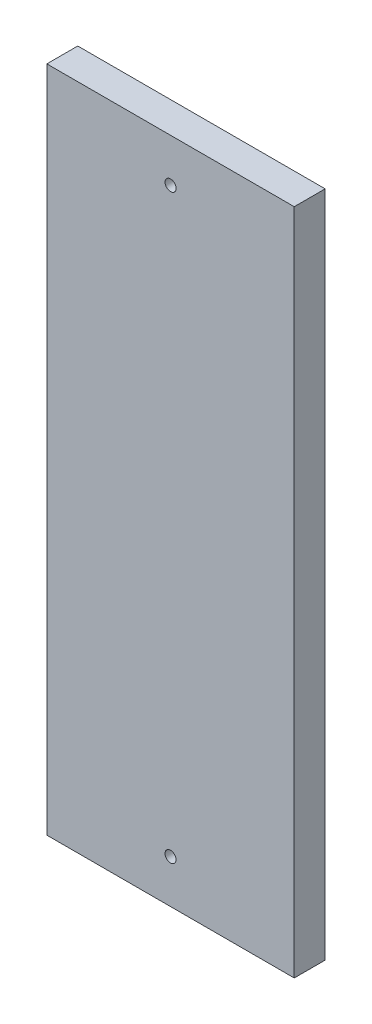
ISO-10303-21;
HEADER;
FILE_DESCRIPTION(('STEP AP214'),'2;1');
FILE_NAME('part.step','',(''),(''),'','','');
FILE_SCHEMA(('AUTOMOTIVE_DESIGN { 1 0 10303 214 1 1 1 1 }'));
ENDSEC;
DATA;
#1=APPLICATION_CONTEXT('core data for automotive mechanical design processes');
#2=APPLICATION_PROTOCOL_DEFINITION('international standard','automotive_design',2000,#1);
#3=PRODUCT_CONTEXT('',#1,'mechanical');
#4=PRODUCT('Part','Part','',(#3));
#5=PRODUCT_RELATED_PRODUCT_CATEGORY('part','',(#4));
#6=PRODUCT_DEFINITION_FORMATION('','',#4);
#7=PRODUCT_DEFINITION_CONTEXT('part definition',#1,'design');
#8=PRODUCT_DEFINITION('design','',#6,#7);
#9=PRODUCT_DEFINITION_SHAPE('','',#8);
#10=(LENGTH_UNIT() NAMED_UNIT(*) SI_UNIT(.MILLI.,.METRE.));
#11=(NAMED_UNIT(*) PLANE_ANGLE_UNIT() SI_UNIT($,.RADIAN.));
#12=(NAMED_UNIT(*) SI_UNIT($,.STERADIAN.) SOLID_ANGLE_UNIT());
#13=UNCERTAINTY_MEASURE_WITH_UNIT(LENGTH_MEASURE(1.E-05),#10,'distance_accuracy_value','');
#14=(GEOMETRIC_REPRESENTATION_CONTEXT(3) GLOBAL_UNCERTAINTY_ASSIGNED_CONTEXT((#13)) GLOBAL_UNIT_ASSIGNED_CONTEXT((#10,
#11,#12)) REPRESENTATION_CONTEXT('',''));
#15=CARTESIAN_POINT('',(0.,0.,0.));
#16=DIRECTION('',(0.,0.,1.));
#17=DIRECTION('',(1.,0.,0.));
#18=AXIS2_PLACEMENT_3D('',#15,#16,#17);
#19=CARTESIAN_POINT('',(25.4,137.16,-3.175));
#20=DIRECTION('',(-1.,0.,0.));
#21=DIRECTION('',(0.,0.,1.));
#22=AXIS2_PLACEMENT_3D('',#19,#20,#21);
#23=PLANE('',#22);
#24=DIRECTION('',(0.,0.,-1.));
#25=VECTOR('',#24,1.);
#26=CARTESIAN_POINT('',(25.4,0.,-3.175));
#27=LINE('',#26,#25);
#28=CARTESIAN_POINT('',(25.4,0.,3.175));
#29=VERTEX_POINT('',#28);
#30=CARTESIAN_POINT('',(25.4,0.,-3.175));
#31=VERTEX_POINT('',#30);
#32=EDGE_CURVE('E96',#29,#31,#27,.T.);
#33=ORIENTED_EDGE('',*,*,#32,.T.);
#34=DIRECTION('',(0.,-1.,0.));
#35=VECTOR('',#34,1.);
#36=CARTESIAN_POINT('',(25.4,137.16,-3.175));
#37=LINE('',#36,#35);
#38=CARTESIAN_POINT('',(25.4,137.16,-3.175));
#39=VERTEX_POINT('',#38);
#40=EDGE_CURVE('E11',#39,#31,#37,.T.);
#41=ORIENTED_EDGE('',*,*,#40,.F.);
#42=DIRECTION('',(0.,0.,-1.));
#43=VECTOR('',#42,1.);
#44=CARTESIAN_POINT('',(25.4,137.16,-3.175));
#45=LINE('',#44,#43);
#46=CARTESIAN_POINT('',(25.4,137.16,3.175));
#47=VERTEX_POINT('',#46);
#48=EDGE_CURVE('E84',#47,#39,#45,.T.);
#49=ORIENTED_EDGE('',*,*,#48,.F.);
#50=DIRECTION('',(0.,-1.,0.));
#51=VECTOR('',#50,1.);
#52=CARTESIAN_POINT('',(25.4,137.16,3.175));
#53=LINE('',#52,#51);
#54=EDGE_CURVE('E92',#47,#29,#53,.T.);
#55=ORIENTED_EDGE('',*,*,#54,.T.);
#56=EDGE_LOOP('',(#33,#41,#49,#55));
#57=FACE_BOUND('',#56,.T.);
#58=ADVANCED_FACE('F33',(#57),#23,.F.);
#59=CARTESIAN_POINT('',(-25.4,137.16,-3.175));
#60=DIRECTION('',(0.,0.,1.));
#61=DIRECTION('',(1.,0.,0.));
#62=AXIS2_PLACEMENT_3D('',#59,#60,#61);
#63=PLANE('',#62);
#64=CARTESIAN_POINT('',(0.,8.89000000000001,-3.175));
#65=DIRECTION('',(0.,0.,-1.));
#66=DIRECTION('',(1.,0.,0.));
#67=AXIS2_PLACEMENT_3D('',#64,#65,#66);
#68=CIRCLE('',#67,1.1303);
#69=CARTESIAN_POINT('',(1.1303,8.89000000000001,-3.175));
#70=VERTEX_POINT('',#69);
#71=EDGE_CURVE('E116',#70,#70,#68,.T.);
#72=ORIENTED_EDGE('',*,*,#71,.F.);
#73=EDGE_LOOP('',(#72));
#74=FACE_BOUND('',#73,.T.);
#75=CARTESIAN_POINT('',(0.,128.27,-3.175));
#76=DIRECTION('',(0.,0.,-1.));
#77=DIRECTION('',(-1.,0.,0.));
#78=AXIS2_PLACEMENT_3D('',#75,#76,#77);
#79=CIRCLE('',#78,1.1303);
#80=CARTESIAN_POINT('',(-1.1303,128.27,-3.175));
#81=VERTEX_POINT('',#80);
#82=EDGE_CURVE('E110',#81,#81,#79,.T.);
#83=ORIENTED_EDGE('',*,*,#82,.F.);
#84=EDGE_LOOP('',(#83));
#85=FACE_BOUND('',#84,.T.);
#86=DIRECTION('',(-1.,0.,0.));
#87=VECTOR('',#86,1.);
#88=CARTESIAN_POINT('',(-25.4,0.,-3.175));
#89=LINE('',#88,#87);
#90=CARTESIAN_POINT('',(-25.4,0.,-3.175));
#91=VERTEX_POINT('',#90);
#92=EDGE_CURVE('E88',#31,#91,#89,.T.);
#93=ORIENTED_EDGE('',*,*,#92,.T.);
#94=DIRECTION('',(0.,-1.,0.));
#95=VECTOR('',#94,1.);
#96=CARTESIAN_POINT('',(-25.4,137.16,-3.175));
#97=LINE('',#96,#95);
#98=CARTESIAN_POINT('',(-25.4,137.16,-3.175));
#99=VERTEX_POINT('',#98);
#100=EDGE_CURVE('E41',#99,#91,#97,.T.);
#101=ORIENTED_EDGE('',*,*,#100,.F.);
#102=DIRECTION('',(-1.,0.,0.));
#103=VECTOR('',#102,1.);
#104=CARTESIAN_POINT('',(-25.4,137.16,-3.175));
#105=LINE('',#104,#103);
#106=EDGE_CURVE('E79',#39,#99,#105,.T.);
#107=ORIENTED_EDGE('',*,*,#106,.F.);
#108=ORIENTED_EDGE('',*,*,#40,.T.);
#109=EDGE_LOOP('',(#93,#101,#107,#108));
#110=FACE_BOUND('',#109,.T.);
#111=ADVANCED_FACE('F87',(#74,#85,#110),#63,.F.);
#112=CARTESIAN_POINT('',(-25.4,137.16,-3.175));
#113=DIRECTION('',(1.,0.,0.));
#114=DIRECTION('',(0.,0.,-1.));
#115=AXIS2_PLACEMENT_3D('',#112,#113,#114);
#116=PLANE('',#115);
#117=DIRECTION('',(0.,0.,1.));
#118=VECTOR('',#117,1.);
#119=CARTESIAN_POINT('',(-25.4,0.,-3.175));
#120=LINE('',#119,#118);
#121=CARTESIAN_POINT('',(-25.4,0.,3.175));
#122=VERTEX_POINT('',#121);
#123=EDGE_CURVE('E66',#91,#122,#120,.T.);
#124=ORIENTED_EDGE('',*,*,#123,.T.);
#125=DIRECTION('',(0.,-1.,0.));
#126=VECTOR('',#125,1.);
#127=CARTESIAN_POINT('',(-25.4,137.16,3.175));
#128=LINE('',#127,#126);
#129=CARTESIAN_POINT('',(-25.4,137.16,3.175));
#130=VERTEX_POINT('',#129);
#131=EDGE_CURVE('E89',#130,#122,#128,.T.);
#132=ORIENTED_EDGE('',*,*,#131,.F.);
#133=DIRECTION('',(0.,0.,1.));
#134=VECTOR('',#133,1.);
#135=CARTESIAN_POINT('',(-25.4,137.16,-3.175));
#136=LINE('',#135,#134);
#137=EDGE_CURVE('E82',#99,#130,#136,.T.);
#138=ORIENTED_EDGE('',*,*,#137,.F.);
#139=ORIENTED_EDGE('',*,*,#100,.T.);
#140=EDGE_LOOP('',(#124,#132,#138,#139));
#141=FACE_BOUND('',#140,.T.);
#142=ADVANCED_FACE('F90',(#141),#116,.F.);
#143=CARTESIAN_POINT('',(-25.4,137.16,3.175));
#144=DIRECTION('',(0.,0.,-1.));
#145=DIRECTION('',(-1.,0.,0.));
#146=AXIS2_PLACEMENT_3D('',#143,#144,#145);
#147=PLANE('',#146);
#148=CARTESIAN_POINT('',(0.,8.89000000000001,3.175));
#149=DIRECTION('',(0.,0.,-1.));
#150=DIRECTION('',(1.,0.,0.));
#151=AXIS2_PLACEMENT_3D('',#148,#149,#150);
#152=CIRCLE('',#151,1.1303);
#153=CARTESIAN_POINT('',(1.1303,8.89000000000001,3.175));
#154=VERTEX_POINT('',#153);
#155=EDGE_CURVE('E113',#154,#154,#152,.T.);
#156=ORIENTED_EDGE('',*,*,#155,.T.);
#157=EDGE_LOOP('',(#156));
#158=FACE_BOUND('',#157,.T.);
#159=CARTESIAN_POINT('',(0.,128.27,3.175));
#160=DIRECTION('',(0.,0.,-1.));
#161=DIRECTION('',(-1.,0.,0.));
#162=AXIS2_PLACEMENT_3D('',#159,#160,#161);
#163=CIRCLE('',#162,1.1303);
#164=CARTESIAN_POINT('',(-1.1303,128.27,3.175));
#165=VERTEX_POINT('',#164);
#166=EDGE_CURVE('E99',#165,#165,#163,.T.);
#167=ORIENTED_EDGE('',*,*,#166,.T.);
#168=EDGE_LOOP('',(#167));
#169=FACE_BOUND('',#168,.T.);
#170=DIRECTION('',(1.,0.,0.));
#171=VECTOR('',#170,1.);
#172=CARTESIAN_POINT('',(-25.4,0.,3.175));
#173=LINE('',#172,#171);
#174=EDGE_CURVE('E72',#122,#29,#173,.T.);
#175=ORIENTED_EDGE('',*,*,#174,.T.);
#176=ORIENTED_EDGE('',*,*,#54,.F.);
#177=DIRECTION('',(1.,0.,0.));
#178=VECTOR('',#177,1.);
#179=CARTESIAN_POINT('',(-25.4,137.16,3.175));
#180=LINE('',#179,#178);
#181=EDGE_CURVE('E49',#130,#47,#180,.T.);
#182=ORIENTED_EDGE('',*,*,#181,.F.);
#183=ORIENTED_EDGE('',*,*,#131,.T.);
#184=EDGE_LOOP('',(#175,#176,#182,#183));
#185=FACE_BOUND('',#184,.T.);
#186=ADVANCED_FACE('F104',(#158,#169,#185),#147,.F.);
#187=CARTESIAN_POINT('',(0.,137.16,0.));
#188=DIRECTION('',(0.,1.,0.));
#189=DIRECTION('',(0.,0.,1.));
#190=AXIS2_PLACEMENT_3D('',#187,#188,#189);
#191=PLANE('',#190);
#192=ORIENTED_EDGE('',*,*,#48,.T.);
#193=ORIENTED_EDGE('',*,*,#106,.T.);
#194=ORIENTED_EDGE('',*,*,#137,.T.);
#195=ORIENTED_EDGE('',*,*,#181,.T.);
#196=EDGE_LOOP('',(#192,#193,#194,#195));
#197=FACE_BOUND('',#196,.T.);
#198=ADVANCED_FACE('F80',(#197),#191,.T.);
#199=CARTESIAN_POINT('',(0.,0.,0.));
#200=DIRECTION('',(0.,1.,0.));
#201=DIRECTION('',(0.,0.,1.));
#202=AXIS2_PLACEMENT_3D('',#199,#200,#201);
#203=PLANE('',#202);
#204=ORIENTED_EDGE('',*,*,#32,.F.);
#205=ORIENTED_EDGE('',*,*,#174,.F.);
#206=ORIENTED_EDGE('',*,*,#123,.F.);
#207=ORIENTED_EDGE('',*,*,#92,.F.);
#208=EDGE_LOOP('',(#204,#205,#206,#207));
#209=FACE_BOUND('',#208,.T.);
#210=ADVANCED_FACE('F107',(#209),#203,.F.);
#211=CARTESIAN_POINT('',(0.,128.27,3.175));
#212=DIRECTION('',(0.,0.,-1.));
#213=DIRECTION('',(-1.,0.,0.));
#214=AXIS2_PLACEMENT_3D('',#211,#212,#213);
#215=CYLINDRICAL_SURFACE('',#214,1.1303);
#216=ORIENTED_EDGE('',*,*,#166,.F.);
#217=EDGE_LOOP('',(#216));
#218=FACE_BOUND('',#217,.T.);
#219=ORIENTED_EDGE('',*,*,#82,.T.);
#220=EDGE_LOOP('',(#219));
#221=FACE_BOUND('',#220,.T.);
#222=ADVANCED_FACE('F127',(#218,#221),#215,.F.);
#223=CARTESIAN_POINT('',(0.,8.89000000000001,3.175));
#224=DIRECTION('',(0.,0.,-1.));
#225=DIRECTION('',(-1.,0.,0.));
#226=AXIS2_PLACEMENT_3D('',#223,#224,#225);
#227=CYLINDRICAL_SURFACE('',#226,1.1303);
#228=ORIENTED_EDGE('',*,*,#155,.F.);
#229=EDGE_LOOP('',(#228));
#230=FACE_BOUND('',#229,.T.);
#231=ORIENTED_EDGE('',*,*,#71,.T.);
#232=EDGE_LOOP('',(#231));
#233=FACE_BOUND('',#232,.T.);
#234=ADVANCED_FACE('F124',(#230,#233),#227,.F.);
#235=CLOSED_SHELL('',(#58,#111,#142,#186,#198,#210,#222,#234));
#236=MANIFOLD_SOLID_BREP('B2',#235);
#237=ADVANCED_BREP_SHAPE_REPRESENTATION('',(#18,#236),#14);
#238=SHAPE_DEFINITION_REPRESENTATION(#9,#237);
ENDSEC;
END-ISO-10303-21;
